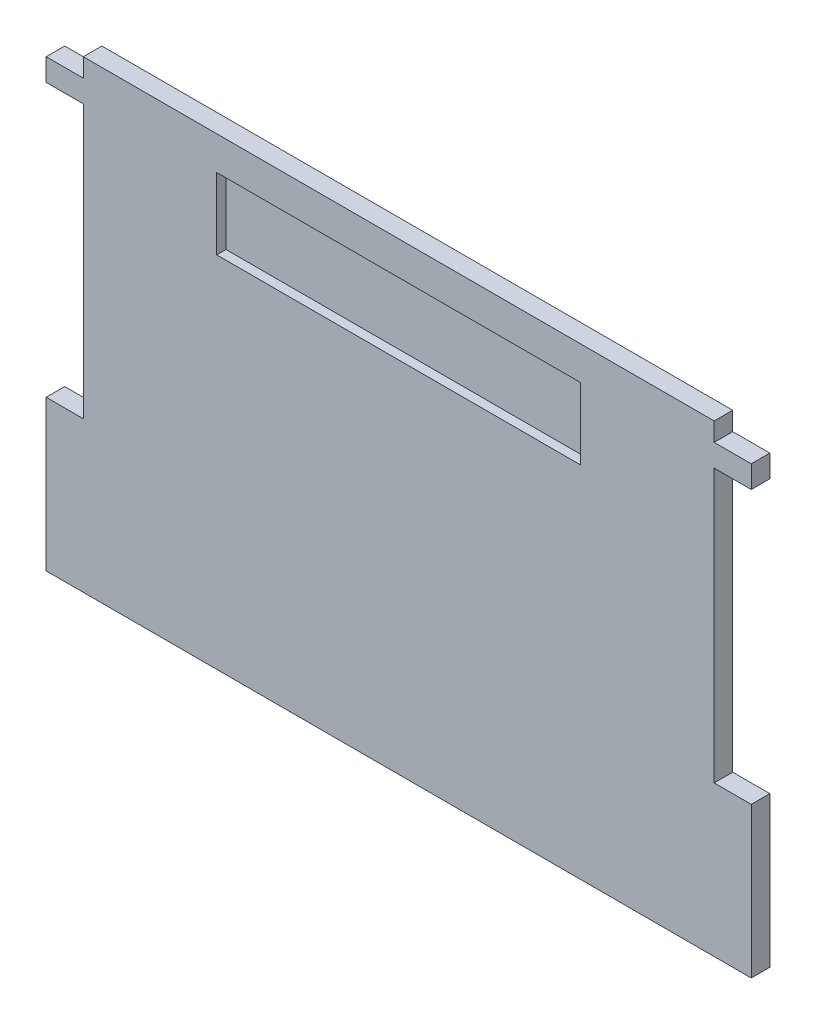
ISO-10303-21;
HEADER;
FILE_DESCRIPTION(('STEP AP214'),'2;1');
FILE_NAME('part.step','',(''),(''),'','','');
FILE_SCHEMA(('AUTOMOTIVE_DESIGN { 1 0 10303 214 1 1 1 1 }'));
ENDSEC;
DATA;
#1=APPLICATION_CONTEXT('core data for automotive mechanical design processes');
#2=APPLICATION_PROTOCOL_DEFINITION('international standard','automotive_design',2000,#1);
#3=PRODUCT_CONTEXT('',#1,'mechanical');
#4=PRODUCT('Part','Part','',(#3));
#5=PRODUCT_RELATED_PRODUCT_CATEGORY('part','',(#4));
#6=PRODUCT_DEFINITION_FORMATION('','',#4);
#7=PRODUCT_DEFINITION_CONTEXT('part definition',#1,'design');
#8=PRODUCT_DEFINITION('design','',#6,#7);
#9=PRODUCT_DEFINITION_SHAPE('','',#8);
#10=(LENGTH_UNIT() NAMED_UNIT(*) SI_UNIT(.MILLI.,.METRE.));
#11=(NAMED_UNIT(*) PLANE_ANGLE_UNIT() SI_UNIT($,.RADIAN.));
#12=(NAMED_UNIT(*) SI_UNIT($,.STERADIAN.) SOLID_ANGLE_UNIT());
#13=UNCERTAINTY_MEASURE_WITH_UNIT(LENGTH_MEASURE(1.E-05),#10,'distance_accuracy_value','');
#14=(GEOMETRIC_REPRESENTATION_CONTEXT(3) GLOBAL_UNCERTAINTY_ASSIGNED_CONTEXT((#13)) GLOBAL_UNIT_ASSIGNED_CONTEXT((#10,
#11,#12)) REPRESENTATION_CONTEXT('',''));
#15=CARTESIAN_POINT('',(0.,0.,0.));
#16=DIRECTION('',(0.,0.,1.));
#17=DIRECTION('',(1.,0.,0.));
#18=AXIS2_PLACEMENT_3D('',#15,#16,#17);
#19=CARTESIAN_POINT('',(0.,0.,1.));
#20=DIRECTION('',(0.,0.,-1.));
#21=DIRECTION('',(-1.,0.,0.));
#22=AXIS2_PLACEMENT_3D('',#19,#20,#21);
#23=PLANE('',#22);
#24=DIRECTION('',(-1.,0.,0.));
#25=VECTOR('',#24,1.);
#26=CARTESIAN_POINT('',(-17.,-0.5,1.));
#27=LINE('',#26,#25);
#28=CARTESIAN_POINT('',(17.,-0.5,1.));
#29=VERTEX_POINT('',#28);
#30=CARTESIAN_POINT('',(-17.,-0.5,1.));
#31=VERTEX_POINT('',#30);
#32=EDGE_CURVE('E234',#29,#31,#27,.T.);
#33=ORIENTED_EDGE('',*,*,#32,.T.);
#34=DIRECTION('',(0.,-1.,0.));
#35=VECTOR('',#34,1.);
#36=CARTESIAN_POINT('',(-17.,-1.5,1.));
#37=LINE('',#36,#35);
#38=CARTESIAN_POINT('',(-17.,-1.5,1.));
#39=VERTEX_POINT('',#38);
#40=EDGE_CURVE('E232',#31,#39,#37,.T.);
#41=ORIENTED_EDGE('',*,*,#40,.T.);
#42=DIRECTION('',(-1.,0.,0.));
#43=VECTOR('',#42,1.);
#44=CARTESIAN_POINT('',(-19.,-1.5,1.));
#45=LINE('',#44,#43);
#46=CARTESIAN_POINT('',(-19.,-1.5,1.));
#47=VERTEX_POINT('',#46);
#48=EDGE_CURVE('E231',#39,#47,#45,.T.);
#49=ORIENTED_EDGE('',*,*,#48,.T.);
#50=DIRECTION('',(0.,-1.,0.));
#51=VECTOR('',#50,1.);
#52=CARTESIAN_POINT('',(-19.,-2.7,1.));
#53=LINE('',#52,#51);
#54=CARTESIAN_POINT('',(-19.,-2.7,1.));
#55=VERTEX_POINT('',#54);
#56=EDGE_CURVE('E227',#47,#55,#53,.T.);
#57=ORIENTED_EDGE('',*,*,#56,.T.);
#58=DIRECTION('',(1.,0.,0.));
#59=VECTOR('',#58,1.);
#60=CARTESIAN_POINT('',(-17.,-2.7,1.));
#61=LINE('',#60,#59);
#62=CARTESIAN_POINT('',(-17.,-2.7,1.));
#63=VERTEX_POINT('',#62);
#64=EDGE_CURVE('E230',#55,#63,#61,.T.);
#65=ORIENTED_EDGE('',*,*,#64,.T.);
#66=DIRECTION('',(0.,-1.,0.));
#67=VECTOR('',#66,1.);
#68=CARTESIAN_POINT('',(-17.,-17.3947217067352,1.));
#69=LINE('',#68,#67);
#70=CARTESIAN_POINT('',(-17.,-17.3947217067352,1.));
#71=VERTEX_POINT('',#70);
#72=EDGE_CURVE('E224',#63,#71,#69,.T.);
#73=ORIENTED_EDGE('',*,*,#72,.T.);
#74=DIRECTION('',(-1.,0.,0.));
#75=VECTOR('',#74,1.);
#76=CARTESIAN_POINT('',(-19.,-17.3947217067352,1.));
#77=LINE('',#76,#75);
#78=CARTESIAN_POINT('',(-19.,-17.3947217067352,1.));
#79=VERTEX_POINT('',#78);
#80=EDGE_CURVE('E223',#71,#79,#77,.T.);
#81=ORIENTED_EDGE('',*,*,#80,.T.);
#82=DIRECTION('',(0.,-1.,0.));
#83=VECTOR('',#82,1.);
#84=CARTESIAN_POINT('',(-19.,-25.5,1.));
#85=LINE('',#84,#83);
#86=CARTESIAN_POINT('',(-19.,-25.5,1.));
#87=VERTEX_POINT('',#86);
#88=EDGE_CURVE('E221',#79,#87,#85,.T.);
#89=ORIENTED_EDGE('',*,*,#88,.T.);
#90=DIRECTION('',(1.,0.,0.));
#91=VECTOR('',#90,1.);
#92=CARTESIAN_POINT('',(19.,-25.5,1.));
#93=LINE('',#92,#91);
#94=CARTESIAN_POINT('',(19.,-25.5,1.));
#95=VERTEX_POINT('',#94);
#96=EDGE_CURVE('E219',#87,#95,#93,.T.);
#97=ORIENTED_EDGE('',*,*,#96,.T.);
#98=DIRECTION('',(0.,1.,0.));
#99=VECTOR('',#98,1.);
#100=CARTESIAN_POINT('',(19.,-17.3947217067352,1.));
#101=LINE('',#100,#99);
#102=CARTESIAN_POINT('',(19.,-17.3947217067352,1.));
#103=VERTEX_POINT('',#102);
#104=EDGE_CURVE('E220',#95,#103,#101,.T.);
#105=ORIENTED_EDGE('',*,*,#104,.T.);
#106=DIRECTION('',(-1.,0.,0.));
#107=VECTOR('',#106,1.);
#108=CARTESIAN_POINT('',(17.,-17.3947217067352,1.));
#109=LINE('',#108,#107);
#110=CARTESIAN_POINT('',(17.,-17.3947217067352,1.));
#111=VERTEX_POINT('',#110);
#112=EDGE_CURVE('E214',#103,#111,#109,.T.);
#113=ORIENTED_EDGE('',*,*,#112,.T.);
#114=DIRECTION('',(0.,1.,0.));
#115=VECTOR('',#114,1.);
#116=CARTESIAN_POINT('',(17.,-2.7,1.));
#117=LINE('',#116,#115);
#118=CARTESIAN_POINT('',(17.,-2.7,1.));
#119=VERTEX_POINT('',#118);
#120=EDGE_CURVE('E211',#111,#119,#117,.T.);
#121=ORIENTED_EDGE('',*,*,#120,.T.);
#122=DIRECTION('',(1.,0.,0.));
#123=VECTOR('',#122,1.);
#124=CARTESIAN_POINT('',(19.,-2.7,1.));
#125=LINE('',#124,#123);
#126=CARTESIAN_POINT('',(19.,-2.7,1.));
#127=VERTEX_POINT('',#126);
#128=EDGE_CURVE('E213',#119,#127,#125,.T.);
#129=ORIENTED_EDGE('',*,*,#128,.T.);
#130=DIRECTION('',(0.,1.,0.));
#131=VECTOR('',#130,1.);
#132=CARTESIAN_POINT('',(19.,-1.5,1.));
#133=LINE('',#132,#131);
#134=CARTESIAN_POINT('',(19.,-1.5,1.));
#135=VERTEX_POINT('',#134);
#136=EDGE_CURVE('E206',#127,#135,#133,.T.);
#137=ORIENTED_EDGE('',*,*,#136,.T.);
#138=DIRECTION('',(-1.,0.,0.));
#139=VECTOR('',#138,1.);
#140=CARTESIAN_POINT('',(17.,-1.5,1.));
#141=LINE('',#140,#139);
#142=CARTESIAN_POINT('',(17.,-1.5,1.));
#143=VERTEX_POINT('',#142);
#144=EDGE_CURVE('E207',#135,#143,#141,.T.);
#145=ORIENTED_EDGE('',*,*,#144,.T.);
#146=DIRECTION('',(0.,1.,0.));
#147=VECTOR('',#146,1.);
#148=CARTESIAN_POINT('',(17.,-0.5,1.));
#149=LINE('',#148,#147);
#150=EDGE_CURVE('E204',#143,#29,#149,.T.);
#151=ORIENTED_EDGE('',*,*,#150,.T.);
#152=EDGE_LOOP('',(#33,#41,#49,#57,#65,#73,#81,#89,#97,#105,#113,#121,#129,#137,#145,#151));
#153=FACE_BOUND('',#152,.T.);
#154=DIRECTION('',(0.,1.,0.));
#155=VECTOR('',#154,1.);
#156=CARTESIAN_POINT('',(-9.80769230769334,-6.15384615384615,1.));
#157=LINE('',#156,#155);
#158=CARTESIAN_POINT('',(-9.80769230769334,-6.15384615384615,1.));
#159=VERTEX_POINT('',#158);
#160=CARTESIAN_POINT('',(-9.80769230769334,-2.30769230769231,1.));
#161=VERTEX_POINT('',#160);
#162=EDGE_CURVE('E52',#159,#161,#157,.T.);
#163=ORIENTED_EDGE('',*,*,#162,.T.);
#164=DIRECTION('',(1.,0.,0.));
#165=VECTOR('',#164,1.);
#166=CARTESIAN_POINT('',(-9.80769230769334,-2.30769230769231,1.));
#167=LINE('',#166,#165);
#168=CARTESIAN_POINT('',(9.80769230769127,-2.30769230769231,1.));
#169=VERTEX_POINT('',#168);
#170=EDGE_CURVE('E191',#161,#169,#167,.T.);
#171=ORIENTED_EDGE('',*,*,#170,.T.);
#172=DIRECTION('',(0.,-1.,0.));
#173=VECTOR('',#172,1.);
#174=CARTESIAN_POINT('',(9.80769230769127,-2.30769230769231,1.));
#175=LINE('',#174,#173);
#176=CARTESIAN_POINT('',(9.80769230769127,-6.15384615384615,1.));
#177=VERTEX_POINT('',#176);
#178=EDGE_CURVE('E585',#169,#177,#175,.T.);
#179=ORIENTED_EDGE('',*,*,#178,.T.);
#180=DIRECTION('',(-1.,0.,0.));
#181=VECTOR('',#180,1.);
#182=CARTESIAN_POINT('',(9.80769230769127,-6.15384615384615,1.));
#183=LINE('',#182,#181);
#184=EDGE_CURVE('E189',#177,#159,#183,.T.);
#185=ORIENTED_EDGE('',*,*,#184,.T.);
#186=EDGE_LOOP('',(#163,#171,#179,#185));
#187=FACE_BOUND('',#186,.T.);
#188=ADVANCED_FACE('F39',(#153,#187),#23,.F.);
#189=CARTESIAN_POINT('',(-17.,-0.5,1.));
#190=DIRECTION('',(0.,-1.,0.));
#191=DIRECTION('',(0.,0.,-1.));
#192=AXIS2_PLACEMENT_3D('',#189,#190,#191);
#193=PLANE('',#192);
#194=DIRECTION('',(1.,0.,0.));
#195=VECTOR('',#194,1.);
#196=CARTESIAN_POINT('',(-17.,-0.5,0.));
#197=LINE('',#196,#195);
#198=CARTESIAN_POINT('',(17.,-0.5,0.));
#199=VERTEX_POINT('',#198);
#200=CARTESIAN_POINT('',(-17.,-0.5,0.));
#201=VERTEX_POINT('',#200);
#202=EDGE_CURVE('E11',#199,#201,#197,.F.);
#203=ORIENTED_EDGE('',*,*,#202,.T.);
#204=DIRECTION('',(0.,0.,-1.));
#205=VECTOR('',#204,1.);
#206=CARTESIAN_POINT('',(-17.,-0.5,1.));
#207=LINE('',#206,#205);
#208=EDGE_CURVE('E193',#31,#201,#207,.T.);
#209=ORIENTED_EDGE('',*,*,#208,.F.);
#210=ORIENTED_EDGE('',*,*,#32,.F.);
#211=DIRECTION('',(0.,0.,-1.));
#212=VECTOR('',#211,1.);
#213=CARTESIAN_POINT('',(17.,-0.5,1.));
#214=LINE('',#213,#212);
#215=EDGE_CURVE('E209',#29,#199,#214,.T.);
#216=ORIENTED_EDGE('',*,*,#215,.T.);
#217=EDGE_LOOP('',(#203,#209,#210,#216));
#218=FACE_BOUND('',#217,.T.);
#219=ADVANCED_FACE('F337',(#218),#193,.F.);
#220=CARTESIAN_POINT('',(-17.,-1.5,1.));
#221=DIRECTION('',(1.,0.,0.));
#222=DIRECTION('',(0.,0.,-1.));
#223=AXIS2_PLACEMENT_3D('',#220,#221,#222);
#224=PLANE('',#223);
#225=DIRECTION('',(0.,1.,0.));
#226=VECTOR('',#225,1.);
#227=CARTESIAN_POINT('',(-17.,-1.5,0.));
#228=LINE('',#227,#226);
#229=CARTESIAN_POINT('',(-17.,-1.5,0.));
#230=VERTEX_POINT('',#229);
#231=EDGE_CURVE('E46',#201,#230,#228,.F.);
#232=ORIENTED_EDGE('',*,*,#231,.T.);
#233=DIRECTION('',(0.,0.,-1.));
#234=VECTOR('',#233,1.);
#235=CARTESIAN_POINT('',(-17.,-1.5,1.));
#236=LINE('',#235,#234);
#237=EDGE_CURVE('E200',#39,#230,#236,.T.);
#238=ORIENTED_EDGE('',*,*,#237,.F.);
#239=ORIENTED_EDGE('',*,*,#40,.F.);
#240=ORIENTED_EDGE('',*,*,#208,.T.);
#241=EDGE_LOOP('',(#232,#238,#239,#240));
#242=FACE_BOUND('',#241,.T.);
#243=ADVANCED_FACE('F307',(#242),#224,.F.);
#244=CARTESIAN_POINT('',(-19.,-1.5,1.));
#245=DIRECTION('',(0.,-1.,0.));
#246=DIRECTION('',(1.,0.,0.));
#247=AXIS2_PLACEMENT_3D('',#244,#245,#246);
#248=PLANE('',#247);
#249=DIRECTION('',(1.,0.,0.));
#250=VECTOR('',#249,1.);
#251=CARTESIAN_POINT('',(-19.,-1.5,0.));
#252=LINE('',#251,#250);
#253=CARTESIAN_POINT('',(-19.,-1.5,0.));
#254=VERTEX_POINT('',#253);
#255=EDGE_CURVE('E310',#230,#254,#252,.F.);
#256=ORIENTED_EDGE('',*,*,#255,.T.);
#257=DIRECTION('',(0.,0.,-1.));
#258=VECTOR('',#257,1.);
#259=CARTESIAN_POINT('',(-19.,-1.5,1.));
#260=LINE('',#259,#258);
#261=EDGE_CURVE('E241',#47,#254,#260,.T.);
#262=ORIENTED_EDGE('',*,*,#261,.F.);
#263=ORIENTED_EDGE('',*,*,#48,.F.);
#264=ORIENTED_EDGE('',*,*,#237,.T.);
#265=EDGE_LOOP('',(#256,#262,#263,#264));
#266=FACE_BOUND('',#265,.T.);
#267=ADVANCED_FACE('F312',(#266),#248,.F.);
#268=CARTESIAN_POINT('',(-19.,-2.7,1.));
#269=DIRECTION('',(1.,0.,0.));
#270=DIRECTION('',(0.,0.,-1.));
#271=AXIS2_PLACEMENT_3D('',#268,#269,#270);
#272=PLANE('',#271);
#273=DIRECTION('',(0.,1.,0.));
#274=VECTOR('',#273,1.);
#275=CARTESIAN_POINT('',(-19.,-2.7,0.));
#276=LINE('',#275,#274);
#277=CARTESIAN_POINT('',(-19.,-2.7,0.));
#278=VERTEX_POINT('',#277);
#279=EDGE_CURVE('E304',#254,#278,#276,.F.);
#280=ORIENTED_EDGE('',*,*,#279,.T.);
#281=DIRECTION('',(0.,0.,-1.));
#282=VECTOR('',#281,1.);
#283=CARTESIAN_POINT('',(-19.,-2.7,1.));
#284=LINE('',#283,#282);
#285=EDGE_CURVE('E250',#55,#278,#284,.T.);
#286=ORIENTED_EDGE('',*,*,#285,.F.);
#287=ORIENTED_EDGE('',*,*,#56,.F.);
#288=ORIENTED_EDGE('',*,*,#261,.T.);
#289=EDGE_LOOP('',(#280,#286,#287,#288));
#290=FACE_BOUND('',#289,.T.);
#291=ADVANCED_FACE('F325',(#290),#272,.F.);
#292=CARTESIAN_POINT('',(-17.,-2.7,1.));
#293=DIRECTION('',(0.,1.,0.));
#294=DIRECTION('',(0.,0.,1.));
#295=AXIS2_PLACEMENT_3D('',#292,#293,#294);
#296=PLANE('',#295);
#297=DIRECTION('',(1.,0.,0.));
#298=VECTOR('',#297,1.);
#299=CARTESIAN_POINT('',(-17.,-2.7,0.));
#300=LINE('',#299,#298);
#301=CARTESIAN_POINT('',(-17.,-2.7,0.));
#302=VERTEX_POINT('',#301);
#303=EDGE_CURVE('E301',#278,#302,#300,.T.);
#304=ORIENTED_EDGE('',*,*,#303,.T.);
#305=DIRECTION('',(0.,0.,-1.));
#306=VECTOR('',#305,1.);
#307=CARTESIAN_POINT('',(-17.,-2.7,1.));
#308=LINE('',#307,#306);
#309=EDGE_CURVE('E248',#63,#302,#308,.T.);
#310=ORIENTED_EDGE('',*,*,#309,.F.);
#311=ORIENTED_EDGE('',*,*,#64,.F.);
#312=ORIENTED_EDGE('',*,*,#285,.T.);
#313=EDGE_LOOP('',(#304,#310,#311,#312));
#314=FACE_BOUND('',#313,.T.);
#315=ADVANCED_FACE('F327',(#314),#296,.F.);
#316=CARTESIAN_POINT('',(-17.,-17.3947217067352,1.));
#317=DIRECTION('',(1.,0.,0.));
#318=DIRECTION('',(0.,0.,-1.));
#319=AXIS2_PLACEMENT_3D('',#316,#317,#318);
#320=PLANE('',#319);
#321=DIRECTION('',(0.,1.,0.));
#322=VECTOR('',#321,1.);
#323=CARTESIAN_POINT('',(-17.,-17.3947217067352,0.));
#324=LINE('',#323,#322);
#325=CARTESIAN_POINT('',(-17.,-17.3947217067352,0.));
#326=VERTEX_POINT('',#325);
#327=EDGE_CURVE('E303',#302,#326,#324,.F.);
#328=ORIENTED_EDGE('',*,*,#327,.T.);
#329=DIRECTION('',(0.,0.,-1.));
#330=VECTOR('',#329,1.);
#331=CARTESIAN_POINT('',(-17.,-17.3947217067352,1.));
#332=LINE('',#331,#330);
#333=EDGE_CURVE('E255',#71,#326,#332,.T.);
#334=ORIENTED_EDGE('',*,*,#333,.F.);
#335=ORIENTED_EDGE('',*,*,#72,.F.);
#336=ORIENTED_EDGE('',*,*,#309,.T.);
#337=EDGE_LOOP('',(#328,#334,#335,#336));
#338=FACE_BOUND('',#337,.T.);
#339=ADVANCED_FACE('F387',(#338),#320,.F.);
#340=CARTESIAN_POINT('',(-19.,-17.3947217067352,1.));
#341=DIRECTION('',(0.,-1.,0.));
#342=DIRECTION('',(0.,0.,-1.));
#343=AXIS2_PLACEMENT_3D('',#340,#341,#342);
#344=PLANE('',#343);
#345=DIRECTION('',(1.,0.,0.));
#346=VECTOR('',#345,1.);
#347=CARTESIAN_POINT('',(-19.,-17.3947217067352,0.));
#348=LINE('',#347,#346);
#349=CARTESIAN_POINT('',(-19.,-17.3947217067352,0.));
#350=VERTEX_POINT('',#349);
#351=EDGE_CURVE('E296',#326,#350,#348,.F.);
#352=ORIENTED_EDGE('',*,*,#351,.T.);
#353=DIRECTION('',(0.,0.,-1.));
#354=VECTOR('',#353,1.);
#355=CARTESIAN_POINT('',(-19.,-17.3947217067352,1.));
#356=LINE('',#355,#354);
#357=EDGE_CURVE('E258',#79,#350,#356,.T.);
#358=ORIENTED_EDGE('',*,*,#357,.F.);
#359=ORIENTED_EDGE('',*,*,#80,.F.);
#360=ORIENTED_EDGE('',*,*,#333,.T.);
#361=EDGE_LOOP('',(#352,#358,#359,#360));
#362=FACE_BOUND('',#361,.T.);
#363=ADVANCED_FACE('F381',(#362),#344,.F.);
#364=CARTESIAN_POINT('',(-19.,-25.5,1.));
#365=DIRECTION('',(1.,0.,0.));
#366=DIRECTION('',(0.,0.,-1.));
#367=AXIS2_PLACEMENT_3D('',#364,#365,#366);
#368=PLANE('',#367);
#369=DIRECTION('',(0.,1.,0.));
#370=VECTOR('',#369,1.);
#371=CARTESIAN_POINT('',(-19.,-25.5,0.));
#372=LINE('',#371,#370);
#373=CARTESIAN_POINT('',(-19.,-25.5,0.));
#374=VERTEX_POINT('',#373);
#375=EDGE_CURVE('E299',#350,#374,#372,.F.);
#376=ORIENTED_EDGE('',*,*,#375,.T.);
#377=DIRECTION('',(0.,0.,-1.));
#378=VECTOR('',#377,1.);
#379=CARTESIAN_POINT('',(-19.,-25.5,1.));
#380=LINE('',#379,#378);
#381=EDGE_CURVE('E260',#87,#374,#380,.T.);
#382=ORIENTED_EDGE('',*,*,#381,.F.);
#383=ORIENTED_EDGE('',*,*,#88,.F.);
#384=ORIENTED_EDGE('',*,*,#357,.T.);
#385=EDGE_LOOP('',(#376,#382,#383,#384));
#386=FACE_BOUND('',#385,.T.);
#387=ADVANCED_FACE('F376',(#386),#368,.F.);
#388=CARTESIAN_POINT('',(19.,-25.5,1.));
#389=DIRECTION('',(0.,1.,0.));
#390=DIRECTION('',(0.,0.,1.));
#391=AXIS2_PLACEMENT_3D('',#388,#389,#390);
#392=PLANE('',#391);
#393=DIRECTION('',(1.,0.,0.));
#394=VECTOR('',#393,1.);
#395=CARTESIAN_POINT('',(19.,-25.5,0.));
#396=LINE('',#395,#394);
#397=CARTESIAN_POINT('',(19.,-25.5,0.));
#398=VERTEX_POINT('',#397);
#399=EDGE_CURVE('E293',#374,#398,#396,.T.);
#400=ORIENTED_EDGE('',*,*,#399,.T.);
#401=DIRECTION('',(0.,0.,-1.));
#402=VECTOR('',#401,1.);
#403=CARTESIAN_POINT('',(19.,-25.5,1.));
#404=LINE('',#403,#402);
#405=EDGE_CURVE('E265',#95,#398,#404,.T.);
#406=ORIENTED_EDGE('',*,*,#405,.F.);
#407=ORIENTED_EDGE('',*,*,#96,.F.);
#408=ORIENTED_EDGE('',*,*,#381,.T.);
#409=EDGE_LOOP('',(#400,#406,#407,#408));
#410=FACE_BOUND('',#409,.T.);
#411=ADVANCED_FACE('F373',(#410),#392,.F.);
#412=CARTESIAN_POINT('',(19.,-17.3947217067352,1.));
#413=DIRECTION('',(-1.,0.,0.));
#414=DIRECTION('',(0.,0.,1.));
#415=AXIS2_PLACEMENT_3D('',#412,#413,#414);
#416=PLANE('',#415);
#417=DIRECTION('',(0.,1.,0.));
#418=VECTOR('',#417,1.);
#419=CARTESIAN_POINT('',(19.,-17.3947217067352,0.));
#420=LINE('',#419,#418);
#421=CARTESIAN_POINT('',(19.,-17.3947217067352,0.));
#422=VERTEX_POINT('',#421);
#423=EDGE_CURVE('E291',#398,#422,#420,.T.);
#424=ORIENTED_EDGE('',*,*,#423,.T.);
#425=DIRECTION('',(0.,0.,-1.));
#426=VECTOR('',#425,1.);
#427=CARTESIAN_POINT('',(19.,-17.3947217067352,1.));
#428=LINE('',#427,#426);
#429=EDGE_CURVE('E262',#103,#422,#428,.T.);
#430=ORIENTED_EDGE('',*,*,#429,.F.);
#431=ORIENTED_EDGE('',*,*,#104,.F.);
#432=ORIENTED_EDGE('',*,*,#405,.T.);
#433=EDGE_LOOP('',(#424,#430,#431,#432));
#434=FACE_BOUND('',#433,.T.);
#435=ADVANCED_FACE('F369',(#434),#416,.F.);
#436=CARTESIAN_POINT('',(17.,-17.3947217067352,1.));
#437=DIRECTION('',(0.,-1.,0.));
#438=DIRECTION('',(0.,0.,-1.));
#439=AXIS2_PLACEMENT_3D('',#436,#437,#438);
#440=PLANE('',#439);
#441=DIRECTION('',(1.,0.,0.));
#442=VECTOR('',#441,1.);
#443=CARTESIAN_POINT('',(17.,-17.3947217067352,0.));
#444=LINE('',#443,#442);
#445=CARTESIAN_POINT('',(17.,-17.3947217067352,0.));
#446=VERTEX_POINT('',#445);
#447=EDGE_CURVE('E292',#422,#446,#444,.F.);
#448=ORIENTED_EDGE('',*,*,#447,.T.);
#449=DIRECTION('',(0.,0.,-1.));
#450=VECTOR('',#449,1.);
#451=CARTESIAN_POINT('',(17.,-17.3947217067352,1.));
#452=LINE('',#451,#450);
#453=EDGE_CURVE('E268',#111,#446,#452,.T.);
#454=ORIENTED_EDGE('',*,*,#453,.F.);
#455=ORIENTED_EDGE('',*,*,#112,.F.);
#456=ORIENTED_EDGE('',*,*,#429,.T.);
#457=EDGE_LOOP('',(#448,#454,#455,#456));
#458=FACE_BOUND('',#457,.T.);
#459=ADVANCED_FACE('F362',(#458),#440,.F.);
#460=CARTESIAN_POINT('',(17.,-2.7,1.));
#461=DIRECTION('',(-1.,0.,0.));
#462=DIRECTION('',(0.,0.,1.));
#463=AXIS2_PLACEMENT_3D('',#460,#461,#462);
#464=PLANE('',#463);
#465=DIRECTION('',(0.,1.,0.));
#466=VECTOR('',#465,1.);
#467=CARTESIAN_POINT('',(17.,-2.7,0.));
#468=LINE('',#467,#466);
#469=CARTESIAN_POINT('',(17.,-2.7,0.));
#470=VERTEX_POINT('',#469);
#471=EDGE_CURVE('E286',#446,#470,#468,.T.);
#472=ORIENTED_EDGE('',*,*,#471,.T.);
#473=DIRECTION('',(0.,0.,-1.));
#474=VECTOR('',#473,1.);
#475=CARTESIAN_POINT('',(17.,-2.7,1.));
#476=LINE('',#475,#474);
#477=EDGE_CURVE('E271',#119,#470,#476,.T.);
#478=ORIENTED_EDGE('',*,*,#477,.F.);
#479=ORIENTED_EDGE('',*,*,#120,.F.);
#480=ORIENTED_EDGE('',*,*,#453,.T.);
#481=EDGE_LOOP('',(#472,#478,#479,#480));
#482=FACE_BOUND('',#481,.T.);
#483=ADVANCED_FACE('F359',(#482),#464,.F.);
#484=CARTESIAN_POINT('',(19.,-2.7,1.));
#485=DIRECTION('',(0.,1.,0.));
#486=DIRECTION('',(0.,0.,1.));
#487=AXIS2_PLACEMENT_3D('',#484,#485,#486);
#488=PLANE('',#487);
#489=DIRECTION('',(1.,0.,0.));
#490=VECTOR('',#489,1.);
#491=CARTESIAN_POINT('',(19.,-2.7,0.));
#492=LINE('',#491,#490);
#493=CARTESIAN_POINT('',(19.,-2.7,0.));
#494=VERTEX_POINT('',#493);
#495=EDGE_CURVE('E289',#470,#494,#492,.T.);
#496=ORIENTED_EDGE('',*,*,#495,.T.);
#497=DIRECTION('',(0.,0.,-1.));
#498=VECTOR('',#497,1.);
#499=CARTESIAN_POINT('',(19.,-2.7,1.));
#500=LINE('',#499,#498);
#501=EDGE_CURVE('E272',#127,#494,#500,.T.);
#502=ORIENTED_EDGE('',*,*,#501,.F.);
#503=ORIENTED_EDGE('',*,*,#128,.F.);
#504=ORIENTED_EDGE('',*,*,#477,.T.);
#505=EDGE_LOOP('',(#496,#502,#503,#504));
#506=FACE_BOUND('',#505,.T.);
#507=ADVANCED_FACE('F352',(#506),#488,.F.);
#508=CARTESIAN_POINT('',(19.,-1.5,1.));
#509=DIRECTION('',(-1.,0.,0.));
#510=DIRECTION('',(0.,0.,1.));
#511=AXIS2_PLACEMENT_3D('',#508,#509,#510);
#512=PLANE('',#511);
#513=DIRECTION('',(0.,1.,0.));
#514=VECTOR('',#513,1.);
#515=CARTESIAN_POINT('',(19.,-1.5,0.));
#516=LINE('',#515,#514);
#517=CARTESIAN_POINT('',(19.,-1.5,0.));
#518=VERTEX_POINT('',#517);
#519=EDGE_CURVE('E283',#494,#518,#516,.T.);
#520=ORIENTED_EDGE('',*,*,#519,.T.);
#521=DIRECTION('',(0.,0.,-1.));
#522=VECTOR('',#521,1.);
#523=CARTESIAN_POINT('',(19.,-1.5,1.));
#524=LINE('',#523,#522);
#525=EDGE_CURVE('E280',#135,#518,#524,.T.);
#526=ORIENTED_EDGE('',*,*,#525,.F.);
#527=ORIENTED_EDGE('',*,*,#136,.F.);
#528=ORIENTED_EDGE('',*,*,#501,.T.);
#529=EDGE_LOOP('',(#520,#526,#527,#528));
#530=FACE_BOUND('',#529,.T.);
#531=ADVANCED_FACE('F350',(#530),#512,.F.);
#532=CARTESIAN_POINT('',(17.,-1.5,1.));
#533=DIRECTION('',(0.,-1.,0.));
#534=DIRECTION('',(1.,0.,0.));
#535=AXIS2_PLACEMENT_3D('',#532,#533,#534);
#536=PLANE('',#535);
#537=DIRECTION('',(1.,0.,0.));
#538=VECTOR('',#537,1.);
#539=CARTESIAN_POINT('',(17.,-1.5,0.));
#540=LINE('',#539,#538);
#541=CARTESIAN_POINT('',(17.,-1.5,0.));
#542=VERTEX_POINT('',#541);
#543=EDGE_CURVE('E284',#518,#542,#540,.F.);
#544=ORIENTED_EDGE('',*,*,#543,.T.);
#545=DIRECTION('',(0.,0.,-1.));
#546=VECTOR('',#545,1.);
#547=CARTESIAN_POINT('',(17.,-1.5,1.));
#548=LINE('',#547,#546);
#549=EDGE_CURVE('E238',#143,#542,#548,.T.);
#550=ORIENTED_EDGE('',*,*,#549,.F.);
#551=ORIENTED_EDGE('',*,*,#144,.F.);
#552=ORIENTED_EDGE('',*,*,#525,.T.);
#553=EDGE_LOOP('',(#544,#550,#551,#552));
#554=FACE_BOUND('',#553,.T.);
#555=ADVANCED_FACE('F343',(#554),#536,.F.);
#556=CARTESIAN_POINT('',(17.,-0.5,1.));
#557=DIRECTION('',(-1.,0.,0.));
#558=DIRECTION('',(0.,0.,1.));
#559=AXIS2_PLACEMENT_3D('',#556,#557,#558);
#560=PLANE('',#559);
#561=DIRECTION('',(0.,1.,0.));
#562=VECTOR('',#561,1.);
#563=CARTESIAN_POINT('',(17.,-0.5,0.));
#564=LINE('',#563,#562);
#565=EDGE_CURVE('E239',#542,#199,#564,.T.);
#566=ORIENTED_EDGE('',*,*,#565,.T.);
#567=ORIENTED_EDGE('',*,*,#215,.F.);
#568=ORIENTED_EDGE('',*,*,#150,.F.);
#569=ORIENTED_EDGE('',*,*,#549,.T.);
#570=EDGE_LOOP('',(#566,#567,#568,#569));
#571=FACE_BOUND('',#570,.T.);
#572=ADVANCED_FACE('F342',(#571),#560,.F.);
#573=CARTESIAN_POINT('',(0.,0.,0.));
#574=DIRECTION('',(0.,0.,-1.));
#575=DIRECTION('',(-1.,0.,0.));
#576=AXIS2_PLACEMENT_3D('',#573,#574,#575);
#577=PLANE('',#576);
#578=ORIENTED_EDGE('',*,*,#202,.F.);
#579=ORIENTED_EDGE('',*,*,#565,.F.);
#580=ORIENTED_EDGE('',*,*,#543,.F.);
#581=ORIENTED_EDGE('',*,*,#519,.F.);
#582=ORIENTED_EDGE('',*,*,#495,.F.);
#583=ORIENTED_EDGE('',*,*,#471,.F.);
#584=ORIENTED_EDGE('',*,*,#447,.F.);
#585=ORIENTED_EDGE('',*,*,#423,.F.);
#586=ORIENTED_EDGE('',*,*,#399,.F.);
#587=ORIENTED_EDGE('',*,*,#375,.F.);
#588=ORIENTED_EDGE('',*,*,#351,.F.);
#589=ORIENTED_EDGE('',*,*,#327,.F.);
#590=ORIENTED_EDGE('',*,*,#303,.F.);
#591=ORIENTED_EDGE('',*,*,#279,.F.);
#592=ORIENTED_EDGE('',*,*,#255,.F.);
#593=ORIENTED_EDGE('',*,*,#231,.F.);
#594=EDGE_LOOP('',(#578,#579,#580,#581,#582,#583,#584,#585,#586,#587,#588,#589,#590,#591,#592,#593));
#595=FACE_BOUND('',#594,.T.);
#596=ADVANCED_FACE('F320',(#595),#577,.T.);
#597=CARTESIAN_POINT('',(-9.80769230769334,-6.15384615384615,0.5));
#598=DIRECTION('',(1.,0.,0.));
#599=DIRECTION('',(0.,0.,-1.));
#600=AXIS2_PLACEMENT_3D('',#597,#598,#599);
#601=PLANE('',#600);
#602=ORIENTED_EDGE('',*,*,#162,.F.);
#603=DIRECTION('',(0.,0.,1.));
#604=VECTOR('',#603,1.);
#605=CARTESIAN_POINT('',(-9.80769230769334,-6.15384615384615,0.5));
#606=LINE('',#605,#604);
#607=CARTESIAN_POINT('',(-9.80769230769334,-6.15384615384615,0.5));
#608=VERTEX_POINT('',#607);
#609=EDGE_CURVE('E188',#608,#159,#606,.T.);
#610=ORIENTED_EDGE('',*,*,#609,.F.);
#611=DIRECTION('',(0.,1.,0.));
#612=VECTOR('',#611,1.);
#613=CARTESIAN_POINT('',(-9.80769230769334,-6.15384615384615,0.5));
#614=LINE('',#613,#612);
#615=CARTESIAN_POINT('',(-9.80769230769334,-2.30769230769231,0.5));
#616=VERTEX_POINT('',#615);
#617=EDGE_CURVE('E181',#608,#616,#614,.T.);
#618=ORIENTED_EDGE('',*,*,#617,.T.);
#619=DIRECTION('',(0.,0.,1.));
#620=VECTOR('',#619,1.);
#621=CARTESIAN_POINT('',(-9.80769230769334,-2.30769230769231,0.5));
#622=LINE('',#621,#620);
#623=EDGE_CURVE('E187',#616,#161,#622,.T.);
#624=ORIENTED_EDGE('',*,*,#623,.T.);
#625=EDGE_LOOP('',(#602,#610,#618,#624));
#626=FACE_BOUND('',#625,.T.);
#627=ADVANCED_FACE('F190',(#626),#601,.T.);
#628=CARTESIAN_POINT('',(-9.80769230769334,-2.30769230769231,0.5));
#629=DIRECTION('',(0.,-1.,0.));
#630=DIRECTION('',(0.,0.,-1.));
#631=AXIS2_PLACEMENT_3D('',#628,#629,#630);
#632=PLANE('',#631);
#633=ORIENTED_EDGE('',*,*,#170,.F.);
#634=ORIENTED_EDGE('',*,*,#623,.F.);
#635=DIRECTION('',(1.,0.,0.));
#636=VECTOR('',#635,1.);
#637=CARTESIAN_POINT('',(-9.80769230769334,-2.30769230769231,0.5));
#638=LINE('',#637,#636);
#639=CARTESIAN_POINT('',(9.80769230769127,-2.30769230769231,0.5));
#640=VERTEX_POINT('',#639);
#641=EDGE_CURVE('E180',#616,#640,#638,.T.);
#642=ORIENTED_EDGE('',*,*,#641,.T.);
#643=DIRECTION('',(0.,0.,1.));
#644=VECTOR('',#643,1.);
#645=CARTESIAN_POINT('',(9.80769230769127,-2.30769230769231,0.5));
#646=LINE('',#645,#644);
#647=EDGE_CURVE('E197',#640,#169,#646,.T.);
#648=ORIENTED_EDGE('',*,*,#647,.T.);
#649=EDGE_LOOP('',(#633,#634,#642,#648));
#650=FACE_BOUND('',#649,.T.);
#651=ADVANCED_FACE('F195',(#650),#632,.T.);
#652=CARTESIAN_POINT('',(9.80769230769127,-2.30769230769231,0.5));
#653=DIRECTION('',(-1.,0.,0.));
#654=DIRECTION('',(0.,0.,1.));
#655=AXIS2_PLACEMENT_3D('',#652,#653,#654);
#656=PLANE('',#655);
#657=ORIENTED_EDGE('',*,*,#178,.F.);
#658=ORIENTED_EDGE('',*,*,#647,.F.);
#659=DIRECTION('',(0.,-1.,0.));
#660=VECTOR('',#659,1.);
#661=CARTESIAN_POINT('',(9.80769230769127,-2.30769230769231,0.5));
#662=LINE('',#661,#660);
#663=CARTESIAN_POINT('',(9.80769230769127,-6.15384615384615,0.5));
#664=VERTEX_POINT('',#663);
#665=EDGE_CURVE('E185',#640,#664,#662,.T.);
#666=ORIENTED_EDGE('',*,*,#665,.T.);
#667=DIRECTION('',(0.,0.,1.));
#668=VECTOR('',#667,1.);
#669=CARTESIAN_POINT('',(9.80769230769127,-6.15384615384615,0.5));
#670=LINE('',#669,#668);
#671=EDGE_CURVE('E198',#664,#177,#670,.T.);
#672=ORIENTED_EDGE('',*,*,#671,.T.);
#673=EDGE_LOOP('',(#657,#658,#666,#672));
#674=FACE_BOUND('',#673,.T.);
#675=ADVANCED_FACE('F513',(#674),#656,.T.);
#676=CARTESIAN_POINT('',(9.80769230769127,-6.15384615384615,0.5));
#677=DIRECTION('',(0.,1.,0.));
#678=DIRECTION('',(0.,0.,1.));
#679=AXIS2_PLACEMENT_3D('',#676,#677,#678);
#680=PLANE('',#679);
#681=ORIENTED_EDGE('',*,*,#184,.F.);
#682=ORIENTED_EDGE('',*,*,#671,.F.);
#683=DIRECTION('',(-1.,0.,0.));
#684=VECTOR('',#683,1.);
#685=CARTESIAN_POINT('',(9.80769230769127,-6.15384615384615,0.5));
#686=LINE('',#685,#684);
#687=EDGE_CURVE('E587',#664,#608,#686,.T.);
#688=ORIENTED_EDGE('',*,*,#687,.T.);
#689=ORIENTED_EDGE('',*,*,#609,.T.);
#690=EDGE_LOOP('',(#681,#682,#688,#689));
#691=FACE_BOUND('',#690,.T.);
#692=ADVANCED_FACE('F522',(#691),#680,.T.);
#693=CARTESIAN_POINT('',(0.,0.,0.5));
#694=DIRECTION('',(0.,0.,-1.));
#695=DIRECTION('',(-1.,0.,0.));
#696=AXIS2_PLACEMENT_3D('',#693,#694,#695);
#697=PLANE('',#696);
#698=ORIENTED_EDGE('',*,*,#617,.F.);
#699=ORIENTED_EDGE('',*,*,#687,.F.);
#700=ORIENTED_EDGE('',*,*,#665,.F.);
#701=ORIENTED_EDGE('',*,*,#641,.F.);
#702=EDGE_LOOP('',(#698,#699,#700,#701));
#703=FACE_BOUND('',#702,.T.);
#704=ADVANCED_FACE('F177',(#703),#697,.F.);
#705=CLOSED_SHELL('',(#188,#219,#243,#267,#291,#315,#339,#363,#387,#411,#435,#459,#483,#507,
#531,#555,#572,#596,#627,#651,#675,#692,#704));
#706=MANIFOLD_SOLID_BREP('B2',#705);
#707=ADVANCED_BREP_SHAPE_REPRESENTATION('',(#18,#706),#14);
#708=SHAPE_DEFINITION_REPRESENTATION(#9,#707);
ENDSEC;
END-ISO-10303-21;
